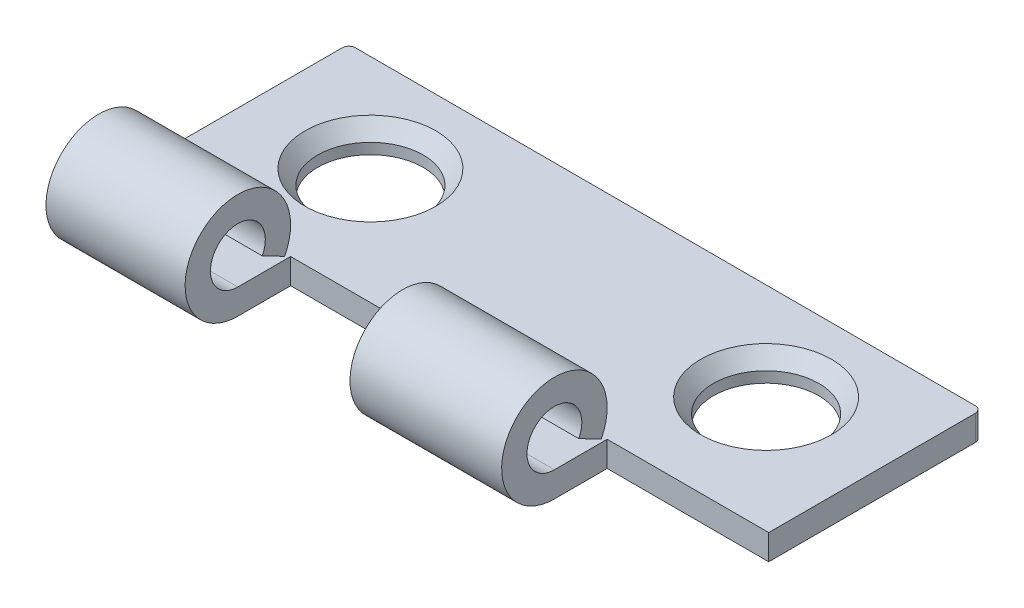
ISO-10303-21;
HEADER;
FILE_DESCRIPTION(('STEP AP214'),'2;1');
FILE_NAME('part.step','',(''),(''),'','','');
FILE_SCHEMA(('AUTOMOTIVE_DESIGN { 1 0 10303 214 1 1 1 1 }'));
ENDSEC;
DATA;
#1=APPLICATION_CONTEXT('core data for automotive mechanical design processes');
#2=APPLICATION_PROTOCOL_DEFINITION('international standard','automotive_design',2000,#1);
#3=PRODUCT_CONTEXT('',#1,'mechanical');
#4=PRODUCT('Part','Part','',(#3));
#5=PRODUCT_RELATED_PRODUCT_CATEGORY('part','',(#4));
#6=PRODUCT_DEFINITION_FORMATION('','',#4);
#7=PRODUCT_DEFINITION_CONTEXT('part definition',#1,'design');
#8=PRODUCT_DEFINITION('design','',#6,#7);
#9=PRODUCT_DEFINITION_SHAPE('','',#8);
#10=(LENGTH_UNIT() NAMED_UNIT(*) SI_UNIT(.MILLI.,.METRE.));
#11=(NAMED_UNIT(*) PLANE_ANGLE_UNIT() SI_UNIT($,.RADIAN.));
#12=(NAMED_UNIT(*) SI_UNIT($,.STERADIAN.) SOLID_ANGLE_UNIT());
#13=UNCERTAINTY_MEASURE_WITH_UNIT(LENGTH_MEASURE(1.E-05),#10,'distance_accuracy_value','');
#14=(GEOMETRIC_REPRESENTATION_CONTEXT(3) GLOBAL_UNCERTAINTY_ASSIGNED_CONTEXT((#13)) GLOBAL_UNIT_ASSIGNED_CONTEXT((#10,
#11,#12)) REPRESENTATION_CONTEXT('',''));
#15=CARTESIAN_POINT('',(0.,0.,0.));
#16=DIRECTION('',(0.,0.,1.));
#17=DIRECTION('',(1.,0.,0.));
#18=AXIS2_PLACEMENT_3D('',#15,#16,#17);
#19=CARTESIAN_POINT('',(-19.05,0.,0.));
#20=DIRECTION('',(1.,0.,0.));
#21=DIRECTION('',(0.,0.,-1.));
#22=AXIS2_PLACEMENT_3D('',#19,#20,#21);
#23=CYLINDRICAL_SURFACE('',#22,3.17500000000008);
#24=DIRECTION('',(1.,0.,0.));
#25=VECTOR('',#24,1.);
#26=CARTESIAN_POINT('',(-19.05,-1.46479493883831,-2.81691334391984));
#27=LINE('',#26,#25);
#28=CARTESIAN_POINT('',(-18.0975,-1.46479493883832,-2.81691334391984));
#29=VERTEX_POINT('',#28);
#30=CARTESIAN_POINT('',(-9.7234375,-1.46479493883832,-2.81691334391984));
#31=VERTEX_POINT('',#30);
#32=EDGE_CURVE('E200',#29,#31,#27,.T.);
#33=ORIENTED_EDGE('',*,*,#32,.F.);
#34=CARTESIAN_POINT('',(-18.0975,0.,0.));
#35=DIRECTION('',(1.,0.,0.));
#36=DIRECTION('',(0.,0.,-1.));
#37=AXIS2_PLACEMENT_3D('',#34,#35,#36);
#38=CIRCLE('',#37,3.17500000000008);
#39=CARTESIAN_POINT('',(-18.0975,-3.175,0.));
#40=VERTEX_POINT('',#39);
#41=EDGE_CURVE('E340',#29,#40,#38,.T.);
#42=ORIENTED_EDGE('',*,*,#41,.T.);
#43=DIRECTION('',(1.,0.,0.));
#44=VECTOR('',#43,1.);
#45=CARTESIAN_POINT('',(-19.05,-3.175,0.));
#46=LINE('',#45,#44);
#47=CARTESIAN_POINT('',(-9.7234375,-3.175,0.));
#48=VERTEX_POINT('',#47);
#49=EDGE_CURVE('E203',#40,#48,#46,.T.);
#50=ORIENTED_EDGE('',*,*,#49,.T.);
#51=CARTESIAN_POINT('',(-9.7234375,0.,0.));
#52=DIRECTION('',(-1.,0.,0.));
#53=DIRECTION('',(0.,0.,1.));
#54=AXIS2_PLACEMENT_3D('',#51,#52,#53);
#55=CIRCLE('',#54,3.17500000000008);
#56=EDGE_CURVE('E266',#48,#31,#55,.T.);
#57=ORIENTED_EDGE('',*,*,#56,.T.);
#58=EDGE_LOOP('',(#33,#42,#50,#57));
#59=FACE_BOUND('',#58,.T.);
#60=ADVANCED_FACE('F41',(#59),#23,.T.);
#61=CARTESIAN_POINT('',(9.32656249999999,0.,0.));
#62=DIRECTION('',(-1.,0.,0.));
#63=DIRECTION('',(0.,0.,1.));
#64=AXIS2_PLACEMENT_3D('',#61,#62,#63);
#65=CIRCLE('',#64,3.17500000000008);
#66=CARTESIAN_POINT('',(9.32656249999999,-3.175,0.));
#67=VERTEX_POINT('',#66);
#68=CARTESIAN_POINT('',(9.32656249999999,-1.46479493883832,-2.81691334391984));
#69=VERTEX_POINT('',#68);
#70=EDGE_CURVE('E311',#67,#69,#65,.T.);
#71=ORIENTED_EDGE('',*,*,#70,.T.);
#72=CARTESIAN_POINT('',(0.198437500000002,-1.46479493883832,-2.81691334391984));
#73=VERTEX_POINT('',#72);
#74=EDGE_CURVE('E199',#73,#69,#27,.T.);
#75=ORIENTED_EDGE('',*,*,#74,.F.);
#76=CARTESIAN_POINT('',(0.198437500000002,0.,0.));
#77=DIRECTION('',(1.,0.,0.));
#78=DIRECTION('',(0.,0.,-1.));
#79=AXIS2_PLACEMENT_3D('',#76,#77,#78);
#80=CIRCLE('',#79,3.17500000000008);
#81=CARTESIAN_POINT('',(0.198437500000001,-3.175,0.));
#82=VERTEX_POINT('',#81);
#83=EDGE_CURVE('E291',#73,#82,#80,.T.);
#84=ORIENTED_EDGE('',*,*,#83,.T.);
#85=EDGE_CURVE('E202',#82,#67,#46,.T.);
#86=ORIENTED_EDGE('',*,*,#85,.T.);
#87=EDGE_LOOP('',(#71,#75,#84,#86));
#88=FACE_BOUND('',#87,.T.);
#89=ADVANCED_FACE('F370',(#88),#23,.T.);
#90=CARTESIAN_POINT('',(-19.05,0.,0.));
#91=DIRECTION('',(1.,0.,0.));
#92=DIRECTION('',(0.,0.,-1.));
#93=AXIS2_PLACEMENT_3D('',#90,#91,#92);
#94=CYLINDRICAL_SURFACE('',#93,1.651);
#95=DIRECTION('',(1.,0.,0.));
#96=VECTOR('',#95,1.);
#97=CARTESIAN_POINT('',(-19.05,-1.651,0.));
#98=LINE('',#97,#96);
#99=CARTESIAN_POINT('',(-18.0975,-1.651,0.));
#100=VERTEX_POINT('',#99);
#101=CARTESIAN_POINT('',(-9.7234375,-1.651,0.));
#102=VERTEX_POINT('',#101);
#103=EDGE_CURVE('E212',#100,#102,#98,.T.);
#104=ORIENTED_EDGE('',*,*,#103,.F.);
#105=CARTESIAN_POINT('',(-18.0975,0.,0.));
#106=DIRECTION('',(1.,0.,0.));
#107=DIRECTION('',(0.,0.,-1.));
#108=AXIS2_PLACEMENT_3D('',#105,#106,#107);
#109=CIRCLE('',#108,1.651);
#110=CARTESIAN_POINT('',(-18.0975,-0.761693368195924,-1.46479493883832));
#111=VERTEX_POINT('',#110);
#112=EDGE_CURVE('E341',#100,#111,#109,.F.);
#113=ORIENTED_EDGE('',*,*,#112,.T.);
#114=DIRECTION('',(1.,0.,0.));
#115=VECTOR('',#114,1.);
#116=CARTESIAN_POINT('',(-19.05,-0.761693368195924,-1.46479493883832));
#117=LINE('',#116,#115);
#118=CARTESIAN_POINT('',(-9.7234375,-0.761693368195924,-1.46479493883832));
#119=VERTEX_POINT('',#118);
#120=EDGE_CURVE('E189',#111,#119,#117,.T.);
#121=ORIENTED_EDGE('',*,*,#120,.T.);
#122=CARTESIAN_POINT('',(-9.7234375,0.,0.));
#123=DIRECTION('',(-1.,0.,0.));
#124=DIRECTION('',(0.,0.,1.));
#125=AXIS2_PLACEMENT_3D('',#122,#123,#124);
#126=CIRCLE('',#125,1.651);
#127=EDGE_CURVE('E319',#119,#102,#126,.F.);
#128=ORIENTED_EDGE('',*,*,#127,.T.);
#129=EDGE_LOOP('',(#104,#113,#121,#128));
#130=FACE_BOUND('',#129,.T.);
#131=ADVANCED_FACE('F388',(#130),#94,.F.);
#132=CARTESIAN_POINT('',(-19.05,-0.761693368195924,-1.46479493883832));
#133=DIRECTION('',(0.,0.887216801234596,-0.461352736641989));
#134=DIRECTION('',(0.,-0.461352736641989,-0.887216801234596));
#135=AXIS2_PLACEMENT_3D('',#132,#133,#134);
#136=PLANE('',#135);
#137=ORIENTED_EDGE('',*,*,#120,.F.);
#138=DIRECTION('',(0.,-0.461352736641989,-0.887216801234595));
#139=VECTOR('',#138,1.);
#140=CARTESIAN_POINT('',(-18.0975,-0.761693368195924,-1.46479493883832));
#141=LINE('',#140,#139);
#142=EDGE_CURVE('E337',#111,#29,#141,.T.);
#143=ORIENTED_EDGE('',*,*,#142,.T.);
#144=ORIENTED_EDGE('',*,*,#32,.T.);
#145=DIRECTION('',(0.,0.461352736641989,0.887216801234596));
#146=VECTOR('',#145,1.);
#147=CARTESIAN_POINT('',(-9.7234375,-0.761693368195924,-1.46479493883832));
#148=LINE('',#147,#146);
#149=EDGE_CURVE('E322',#31,#119,#148,.T.);
#150=ORIENTED_EDGE('',*,*,#149,.T.);
#151=EDGE_LOOP('',(#137,#143,#144,#150));
#152=FACE_BOUND('',#151,.T.);
#153=ADVANCED_FACE('F335',(#152),#136,.F.);
#154=CARTESIAN_POINT('',(0.198437500000002,-0.761693368195924,-1.46479493883832));
#155=VERTEX_POINT('',#154);
#156=CARTESIAN_POINT('',(9.32656249999999,-0.761693368195924,-1.46479493883832));
#157=VERTEX_POINT('',#156);
#158=EDGE_CURVE('E185',#155,#157,#117,.T.);
#159=ORIENTED_EDGE('',*,*,#158,.T.);
#160=CARTESIAN_POINT('',(9.32656249999999,0.,0.));
#161=DIRECTION('',(-1.,0.,0.));
#162=DIRECTION('',(0.,0.,1.));
#163=AXIS2_PLACEMENT_3D('',#160,#161,#162);
#164=CIRCLE('',#163,1.651);
#165=CARTESIAN_POINT('',(9.32656249999999,-1.651,0.));
#166=VERTEX_POINT('',#165);
#167=EDGE_CURVE('E290',#157,#166,#164,.F.);
#168=ORIENTED_EDGE('',*,*,#167,.T.);
#169=CARTESIAN_POINT('',(0.198437500000002,-1.651,0.));
#170=VERTEX_POINT('',#169);
#171=EDGE_CURVE('E211',#170,#166,#98,.T.);
#172=ORIENTED_EDGE('',*,*,#171,.F.);
#173=CARTESIAN_POINT('',(0.198437500000002,0.,0.));
#174=DIRECTION('',(1.,0.,0.));
#175=DIRECTION('',(0.,0.,-1.));
#176=AXIS2_PLACEMENT_3D('',#173,#174,#175);
#177=CIRCLE('',#176,1.651);
#178=EDGE_CURVE('E289',#170,#155,#177,.F.);
#179=ORIENTED_EDGE('',*,*,#178,.T.);
#180=EDGE_LOOP('',(#159,#168,#172,#179));
#181=FACE_BOUND('',#180,.T.);
#182=ADVANCED_FACE('F362',(#181),#94,.F.);
#183=CARTESIAN_POINT('',(-19.05,-1.65099999999999,-16.002));
#184=DIRECTION('',(0.,-1.,0.));
#185=DIRECTION('',(0.,0.,1.));
#186=AXIS2_PLACEMENT_3D('',#183,#184,#185);
#187=PLANE('',#186);
#188=CARTESIAN_POINT('',(11.90625,-1.65099999999999,-10.16));
#189=DIRECTION('',(0.,1.,0.));
#190=DIRECTION('',(0.,0.,-1.));
#191=AXIS2_PLACEMENT_3D('',#188,#189,#190);
#192=CIRCLE('',#191,3.937);
#193=CARTESIAN_POINT('',(11.90625,-1.65099999999999,-14.097));
#194=VERTEX_POINT('',#193);
#195=EDGE_CURVE('E224',#194,#194,#192,.T.);
#196=ORIENTED_EDGE('',*,*,#195,.F.);
#197=EDGE_LOOP('',(#196));
#198=FACE_BOUND('',#197,.T.);
#199=CARTESIAN_POINT('',(-11.90625,-1.65099999999999,-10.16));
#200=DIRECTION('',(0.,1.,0.));
#201=DIRECTION('',(0.,0.,-1.));
#202=AXIS2_PLACEMENT_3D('',#199,#200,#201);
#203=CIRCLE('',#202,3.937);
#204=CARTESIAN_POINT('',(-11.90625,-1.65099999999999,-14.097));
#205=VERTEX_POINT('',#204);
#206=EDGE_CURVE('E343',#205,#205,#203,.T.);
#207=ORIENTED_EDGE('',*,*,#206,.F.);
#208=EDGE_LOOP('',(#207));
#209=FACE_BOUND('',#208,.T.);
#210=DIRECTION('',(1.,0.,0.));
#211=VECTOR('',#210,1.);
#212=CARTESIAN_POINT('',(-19.05,-1.651,-3.17500000000013));
#213=LINE('',#212,#211);
#214=CARTESIAN_POINT('',(-19.05,-1.651,-3.17500000000013));
#215=VERTEX_POINT('',#214);
#216=CARTESIAN_POINT('',(-18.0975,-1.651,-3.17500000000012));
#217=VERTEX_POINT('',#216);
#218=EDGE_CURVE('E56',#215,#217,#213,.T.);
#219=ORIENTED_EDGE('',*,*,#218,.T.);
#220=DIRECTION('',(0.,0.,1.));
#221=VECTOR('',#220,1.);
#222=CARTESIAN_POINT('',(-18.0975,-1.65099999999999,-16.002));
#223=LINE('',#222,#221);
#224=EDGE_CURVE('E345',#217,#100,#223,.T.);
#225=ORIENTED_EDGE('',*,*,#224,.T.);
#226=ORIENTED_EDGE('',*,*,#103,.T.);
#227=DIRECTION('',(0.,0.,-1.));
#228=VECTOR('',#227,1.);
#229=CARTESIAN_POINT('',(-9.7234375,-1.65099999999999,-16.002));
#230=LINE('',#229,#228);
#231=CARTESIAN_POINT('',(-9.7234375,-1.651,-3.17500000000003));
#232=VERTEX_POINT('',#231);
#233=EDGE_CURVE('E277',#102,#232,#230,.T.);
#234=ORIENTED_EDGE('',*,*,#233,.T.);
#235=DIRECTION('',(1.,0.,0.));
#236=VECTOR('',#235,1.);
#237=CARTESIAN_POINT('',(-19.05,-1.651,-3.17500000000003));
#238=LINE('',#237,#236);
#239=CARTESIAN_POINT('',(0.198437500000001,-1.651,-3.17500000000003));
#240=VERTEX_POINT('',#239);
#241=EDGE_CURVE('E197',#232,#240,#238,.T.);
#242=ORIENTED_EDGE('',*,*,#241,.T.);
#243=DIRECTION('',(0.,0.,1.));
#244=VECTOR('',#243,1.);
#245=CARTESIAN_POINT('',(0.198437500000002,-1.65099999999999,-16.002));
#246=LINE('',#245,#244);
#247=EDGE_CURVE('E274',#240,#170,#246,.T.);
#248=ORIENTED_EDGE('',*,*,#247,.T.);
#249=ORIENTED_EDGE('',*,*,#171,.T.);
#250=DIRECTION('',(0.,0.,-1.));
#251=VECTOR('',#250,1.);
#252=CARTESIAN_POINT('',(9.32656249999999,-1.65099999999999,-16.002));
#253=LINE('',#252,#251);
#254=CARTESIAN_POINT('',(9.32656249999999,-1.651,-3.17500000000003));
#255=VERTEX_POINT('',#254);
#256=EDGE_CURVE('E313',#166,#255,#253,.T.);
#257=ORIENTED_EDGE('',*,*,#256,.T.);
#258=DIRECTION('',(1.,0.,0.));
#259=VECTOR('',#258,1.);
#260=CARTESIAN_POINT('',(-19.05,-1.651,-3.17500000000003));
#261=LINE('',#260,#259);
#262=CARTESIAN_POINT('',(19.05,-1.651,-3.17500000000003));
#263=VERTEX_POINT('',#262);
#264=EDGE_CURVE('E261',#255,#263,#261,.T.);
#265=ORIENTED_EDGE('',*,*,#264,.T.);
#266=DIRECTION('',(0.,0.,-1.));
#267=VECTOR('',#266,1.);
#268=CARTESIAN_POINT('',(19.05,-1.65099999999999,-16.002));
#269=LINE('',#268,#267);
#270=CARTESIAN_POINT('',(19.05,-1.65099999999999,-15.605125));
#271=VERTEX_POINT('',#270);
#272=EDGE_CURVE('E195',#263,#271,#269,.T.);
#273=ORIENTED_EDGE('',*,*,#272,.T.);
#274=CARTESIAN_POINT('',(18.653125,-1.65099999999999,-15.605125));
#275=DIRECTION('',(0.,-1.,0.));
#276=DIRECTION('',(0.,0.,1.));
#277=AXIS2_PLACEMENT_3D('',#274,#275,#276);
#278=CIRCLE('',#277,0.396875);
#279=CARTESIAN_POINT('',(18.653125,-1.65099999999999,-16.002));
#280=VERTEX_POINT('',#279);
#281=EDGE_CURVE('E238',#271,#280,#278,.F.);
#282=ORIENTED_EDGE('',*,*,#281,.T.);
#283=DIRECTION('',(1.,0.,0.));
#284=VECTOR('',#283,1.);
#285=CARTESIAN_POINT('',(-19.05,-1.65099999999999,-16.002));
#286=LINE('',#285,#284);
#287=CARTESIAN_POINT('',(-18.653125,-1.65099999999999,-16.002));
#288=VERTEX_POINT('',#287);
#289=EDGE_CURVE('E208',#288,#280,#286,.T.);
#290=ORIENTED_EDGE('',*,*,#289,.F.);
#291=CARTESIAN_POINT('',(-18.653125,-1.65099999999999,-15.605125));
#292=DIRECTION('',(0.,-1.,0.));
#293=DIRECTION('',(0.,0.,1.));
#294=AXIS2_PLACEMENT_3D('',#291,#292,#293);
#295=CIRCLE('',#294,0.396875);
#296=CARTESIAN_POINT('',(-19.05,-1.65099999999999,-15.605125));
#297=VERTEX_POINT('',#296);
#298=EDGE_CURVE('E240',#288,#297,#295,.F.);
#299=ORIENTED_EDGE('',*,*,#298,.T.);
#300=DIRECTION('',(0.,0.,-1.));
#301=VECTOR('',#300,1.);
#302=CARTESIAN_POINT('',(-19.05,-1.65099999999999,-16.002));
#303=LINE('',#302,#301);
#304=EDGE_CURVE('E186',#215,#297,#303,.T.);
#305=ORIENTED_EDGE('',*,*,#304,.F.);
#306=EDGE_LOOP('',(#219,#225,#226,#234,#242,#248,#249,#257,#265,#273,#282,#290,#299,#305));
#307=FACE_BOUND('',#306,.T.);
#308=ADVANCED_FACE('F245',(#198,#209,#307),#187,.F.);
#309=CARTESIAN_POINT('',(-19.05,-3.17499999999999,-16.002));
#310=DIRECTION('',(0.,0.,1.));
#311=DIRECTION('',(1.,0.,0.));
#312=AXIS2_PLACEMENT_3D('',#309,#310,#311);
#313=PLANE('',#312);
#314=DIRECTION('',(1.,0.,0.));
#315=VECTOR('',#314,1.);
#316=CARTESIAN_POINT('',(-19.05,-3.17499999999999,-16.002));
#317=LINE('',#316,#315);
#318=CARTESIAN_POINT('',(-18.653125,-3.17499999999999,-16.002));
#319=VERTEX_POINT('',#318);
#320=CARTESIAN_POINT('',(18.653125,-3.17499999999999,-16.002));
#321=VERTEX_POINT('',#320);
#322=EDGE_CURVE('E205',#319,#321,#317,.T.);
#323=ORIENTED_EDGE('',*,*,#322,.F.);
#324=DIRECTION('',(0.,-1.,0.));
#325=VECTOR('',#324,1.);
#326=CARTESIAN_POINT('',(-18.653125,-3.17499999999999,-16.002));
#327=LINE('',#326,#325);
#328=EDGE_CURVE('E236',#319,#288,#327,.F.);
#329=ORIENTED_EDGE('',*,*,#328,.T.);
#330=ORIENTED_EDGE('',*,*,#289,.T.);
#331=DIRECTION('',(0.,-1.,0.));
#332=VECTOR('',#331,1.);
#333=CARTESIAN_POINT('',(18.653125,-3.17499999999999,-16.002));
#334=LINE('',#333,#332);
#335=EDGE_CURVE('E233',#280,#321,#334,.T.);
#336=ORIENTED_EDGE('',*,*,#335,.T.);
#337=EDGE_LOOP('',(#323,#329,#330,#336));
#338=FACE_BOUND('',#337,.T.);
#339=ADVANCED_FACE('F251',(#338),#313,.F.);
#340=CARTESIAN_POINT('',(-19.05,-3.175,0.));
#341=DIRECTION('',(0.,1.,0.));
#342=DIRECTION('',(0.,0.,-1.));
#343=AXIS2_PLACEMENT_3D('',#340,#341,#342);
#344=PLANE('',#343);
#345=CARTESIAN_POINT('',(-11.90625,-3.175,-10.16));
#346=DIRECTION('',(0.,1.,0.));
#347=DIRECTION('',(0.,0.,-1.));
#348=AXIS2_PLACEMENT_3D('',#345,#346,#347);
#349=CIRCLE('',#348,3.175);
#350=CARTESIAN_POINT('',(-11.90625,-3.17499999999999,-13.335));
#351=VERTEX_POINT('',#350);
#352=EDGE_CURVE('E307',#351,#351,#349,.T.);
#353=ORIENTED_EDGE('',*,*,#352,.T.);
#354=EDGE_LOOP('',(#353));
#355=FACE_BOUND('',#354,.T.);
#356=CARTESIAN_POINT('',(11.90625,-3.175,-10.16));
#357=DIRECTION('',(0.,1.,0.));
#358=DIRECTION('',(0.,0.,-1.));
#359=AXIS2_PLACEMENT_3D('',#356,#357,#358);
#360=CIRCLE('',#359,3.175);
#361=CARTESIAN_POINT('',(11.90625,-3.17499999999999,-13.335));
#362=VERTEX_POINT('',#361);
#363=EDGE_CURVE('E227',#362,#362,#360,.T.);
#364=ORIENTED_EDGE('',*,*,#363,.T.);
#365=EDGE_LOOP('',(#364));
#366=FACE_BOUND('',#365,.T.);
#367=ORIENTED_EDGE('',*,*,#49,.F.);
#368=DIRECTION('',(0.,0.,1.));
#369=VECTOR('',#368,1.);
#370=CARTESIAN_POINT('',(-18.0975,-3.175,-3.17500000000013));
#371=LINE('',#370,#369);
#372=CARTESIAN_POINT('',(-18.0975,-3.175,-3.17500000000013));
#373=VERTEX_POINT('',#372);
#374=EDGE_CURVE('E178',#373,#40,#371,.T.);
#375=ORIENTED_EDGE('',*,*,#374,.F.);
#376=DIRECTION('',(1.,0.,0.));
#377=VECTOR('',#376,1.);
#378=CARTESIAN_POINT('',(-18.0975,-3.175,-3.17500000000013));
#379=LINE('',#378,#377);
#380=CARTESIAN_POINT('',(-19.05,-3.175,-3.17500000000013));
#381=VERTEX_POINT('',#380);
#382=EDGE_CURVE('E167',#381,#373,#379,.T.);
#383=ORIENTED_EDGE('',*,*,#382,.F.);
#384=DIRECTION('',(0.,0.,1.));
#385=VECTOR('',#384,1.);
#386=CARTESIAN_POINT('',(-19.05,-3.175,0.));
#387=LINE('',#386,#385);
#388=CARTESIAN_POINT('',(-19.05,-3.17499999999999,-15.605125));
#389=VERTEX_POINT('',#388);
#390=EDGE_CURVE('E176',#389,#381,#387,.T.);
#391=ORIENTED_EDGE('',*,*,#390,.F.);
#392=CARTESIAN_POINT('',(-18.653125,-3.17499999999999,-15.605125));
#393=DIRECTION('',(0.,1.,0.));
#394=DIRECTION('',(0.,0.,-1.));
#395=AXIS2_PLACEMENT_3D('',#392,#393,#394);
#396=CIRCLE('',#395,0.396875);
#397=EDGE_CURVE('E231',#389,#319,#396,.F.);
#398=ORIENTED_EDGE('',*,*,#397,.T.);
#399=ORIENTED_EDGE('',*,*,#322,.T.);
#400=CARTESIAN_POINT('',(18.653125,-3.17499999999999,-15.605125));
#401=DIRECTION('',(0.,1.,0.));
#402=DIRECTION('',(0.,0.,-1.));
#403=AXIS2_PLACEMENT_3D('',#400,#401,#402);
#404=CIRCLE('',#403,0.396875);
#405=CARTESIAN_POINT('',(19.05,-3.17499999999999,-15.605125));
#406=VERTEX_POINT('',#405);
#407=EDGE_CURVE('E229',#321,#406,#404,.F.);
#408=ORIENTED_EDGE('',*,*,#407,.T.);
#409=DIRECTION('',(0.,0.,1.));
#410=VECTOR('',#409,1.);
#411=CARTESIAN_POINT('',(19.05,-3.175,0.));
#412=LINE('',#411,#410);
#413=CARTESIAN_POINT('',(19.05,-3.175,-3.17500000000003));
#414=VERTEX_POINT('',#413);
#415=EDGE_CURVE('E191',#406,#414,#412,.T.);
#416=ORIENTED_EDGE('',*,*,#415,.T.);
#417=DIRECTION('',(-1.,0.,0.));
#418=VECTOR('',#417,1.);
#419=CARTESIAN_POINT('',(9.525,-3.175,-3.17500000000003));
#420=LINE('',#419,#418);
#421=CARTESIAN_POINT('',(9.32656249999999,-3.175,-3.17500000000003));
#422=VERTEX_POINT('',#421);
#423=EDGE_CURVE('E262',#414,#422,#420,.T.);
#424=ORIENTED_EDGE('',*,*,#423,.T.);
#425=DIRECTION('',(0.,0.,1.));
#426=VECTOR('',#425,1.);
#427=CARTESIAN_POINT('',(9.32656249999999,-3.175,3.17500000000013));
#428=LINE('',#427,#426);
#429=EDGE_CURVE('E294',#422,#67,#428,.T.);
#430=ORIENTED_EDGE('',*,*,#429,.T.);
#431=ORIENTED_EDGE('',*,*,#85,.F.);
#432=DIRECTION('',(0.,0.,-1.));
#433=VECTOR('',#432,1.);
#434=CARTESIAN_POINT('',(0.198437500000001,-3.175,3.17500000000013));
#435=LINE('',#434,#433);
#436=CARTESIAN_POINT('',(0.198437500000001,-3.175,-3.17500000000003));
#437=VERTEX_POINT('',#436);
#438=EDGE_CURVE('E295',#82,#437,#435,.T.);
#439=ORIENTED_EDGE('',*,*,#438,.T.);
#440=DIRECTION('',(-1.,0.,0.));
#441=VECTOR('',#440,1.);
#442=CARTESIAN_POINT('',(-9.525,-3.175,-3.17500000000003));
#443=LINE('',#442,#441);
#444=CARTESIAN_POINT('',(-9.7234375,-3.175,-3.17500000000003));
#445=VERTEX_POINT('',#444);
#446=EDGE_CURVE('E264',#437,#445,#443,.T.);
#447=ORIENTED_EDGE('',*,*,#446,.T.);
#448=DIRECTION('',(0.,0.,1.));
#449=VECTOR('',#448,1.);
#450=CARTESIAN_POINT('',(-9.7234375,-3.175,3.17500000000013));
#451=LINE('',#450,#449);
#452=EDGE_CURVE('E304',#445,#48,#451,.T.);
#453=ORIENTED_EDGE('',*,*,#452,.T.);
#454=EDGE_LOOP('',(#367,#375,#383,#391,#398,#399,#408,#416,#424,#430,#431,#439,#447,#453));
#455=FACE_BOUND('',#454,.T.);
#456=ADVANCED_FACE('F175',(#355,#366,#455),#344,.F.);
#457=ORIENTED_EDGE('',*,*,#74,.T.);
#458=DIRECTION('',(0.,0.461352736641989,0.887216801234596));
#459=VECTOR('',#458,1.);
#460=CARTESIAN_POINT('',(9.32656249999999,-0.761693368195924,-1.46479493883832));
#461=LINE('',#460,#459);
#462=EDGE_CURVE('E217',#69,#157,#461,.T.);
#463=ORIENTED_EDGE('',*,*,#462,.T.);
#464=ORIENTED_EDGE('',*,*,#158,.F.);
#465=DIRECTION('',(0.,-0.461352736641989,-0.887216801234596));
#466=VECTOR('',#465,1.);
#467=CARTESIAN_POINT('',(0.198437500000002,-0.761693368195924,-1.46479493883832));
#468=LINE('',#467,#466);
#469=EDGE_CURVE('E214',#155,#73,#468,.T.);
#470=ORIENTED_EDGE('',*,*,#469,.T.);
#471=EDGE_LOOP('',(#457,#463,#464,#470));
#472=FACE_BOUND('',#471,.T.);
#473=ADVANCED_FACE('F367',(#472),#136,.F.);
#474=CARTESIAN_POINT('',(-19.05,0.,0.));
#475=DIRECTION('',(1.,0.,0.));
#476=DIRECTION('',(0.,0.,-1.));
#477=AXIS2_PLACEMENT_3D('',#474,#475,#476);
#478=PLANE('',#477);
#479=ORIENTED_EDGE('',*,*,#390,.T.);
#480=DIRECTION('',(0.,1.,0.));
#481=VECTOR('',#480,1.);
#482=CARTESIAN_POINT('',(-19.05,0.,-3.17500000000013));
#483=LINE('',#482,#481);
#484=EDGE_CURVE('E11',#381,#215,#483,.T.);
#485=ORIENTED_EDGE('',*,*,#484,.T.);
#486=ORIENTED_EDGE('',*,*,#304,.T.);
#487=DIRECTION('',(0.,-1.,0.));
#488=VECTOR('',#487,1.);
#489=CARTESIAN_POINT('',(-19.05,0.,-15.605125));
#490=LINE('',#489,#488);
#491=EDGE_CURVE('E184',#297,#389,#490,.T.);
#492=ORIENTED_EDGE('',*,*,#491,.T.);
#493=EDGE_LOOP('',(#479,#485,#486,#492));
#494=FACE_BOUND('',#493,.T.);
#495=ADVANCED_FACE('F182',(#494),#478,.F.);
#496=CARTESIAN_POINT('',(19.05,0.,0.));
#497=DIRECTION('',(1.,0.,0.));
#498=DIRECTION('',(0.,0.,-1.));
#499=AXIS2_PLACEMENT_3D('',#496,#497,#498);
#500=PLANE('',#499);
#501=ORIENTED_EDGE('',*,*,#415,.F.);
#502=DIRECTION('',(0.,-1.,0.));
#503=VECTOR('',#502,1.);
#504=CARTESIAN_POINT('',(19.05,-1.65099999999999,-15.605125));
#505=LINE('',#504,#503);
#506=EDGE_CURVE('E49',#406,#271,#505,.F.);
#507=ORIENTED_EDGE('',*,*,#506,.T.);
#508=ORIENTED_EDGE('',*,*,#272,.F.);
#509=DIRECTION('',(0.,1.,0.));
#510=VECTOR('',#509,1.);
#511=CARTESIAN_POINT('',(19.05,-3.175,-3.17500000000003));
#512=LINE('',#511,#510);
#513=EDGE_CURVE('E258',#414,#263,#512,.T.);
#514=ORIENTED_EDGE('',*,*,#513,.F.);
#515=EDGE_LOOP('',(#501,#507,#508,#514));
#516=FACE_BOUND('',#515,.T.);
#517=ADVANCED_FACE('F257',(#516),#500,.T.);
#518=CARTESIAN_POINT('',(-9.525,-3.175,-3.17500000000003));
#519=DIRECTION('',(0.,0.,-1.));
#520=DIRECTION('',(-1.,0.,0.));
#521=AXIS2_PLACEMENT_3D('',#518,#519,#520);
#522=PLANE('',#521);
#523=ORIENTED_EDGE('',*,*,#241,.F.);
#524=DIRECTION('',(0.,1.,0.));
#525=VECTOR('',#524,1.);
#526=CARTESIAN_POINT('',(-9.7234375,-3.175,-3.17500000000003));
#527=LINE('',#526,#525);
#528=EDGE_CURVE('E300',#445,#232,#527,.T.);
#529=ORIENTED_EDGE('',*,*,#528,.F.);
#530=ORIENTED_EDGE('',*,*,#446,.F.);
#531=DIRECTION('',(0.,1.,0.));
#532=VECTOR('',#531,1.);
#533=CARTESIAN_POINT('',(0.198437500000001,-3.175,-3.17500000000003));
#534=LINE('',#533,#532);
#535=EDGE_CURVE('E286',#437,#240,#534,.T.);
#536=ORIENTED_EDGE('',*,*,#535,.T.);
#537=EDGE_LOOP('',(#523,#529,#530,#536));
#538=FACE_BOUND('',#537,.T.);
#539=ADVANCED_FACE('F293',(#538),#522,.F.);
#540=CARTESIAN_POINT('',(9.525,-3.175,-3.17500000000003));
#541=DIRECTION('',(0.,0.,-1.));
#542=DIRECTION('',(-1.,0.,0.));
#543=AXIS2_PLACEMENT_3D('',#540,#541,#542);
#544=PLANE('',#543);
#545=ORIENTED_EDGE('',*,*,#264,.F.);
#546=DIRECTION('',(0.,1.,0.));
#547=VECTOR('',#546,1.);
#548=CARTESIAN_POINT('',(9.32656249999999,-3.175,-3.17500000000003));
#549=LINE('',#548,#547);
#550=EDGE_CURVE('E298',#422,#255,#549,.T.);
#551=ORIENTED_EDGE('',*,*,#550,.F.);
#552=ORIENTED_EDGE('',*,*,#423,.F.);
#553=ORIENTED_EDGE('',*,*,#513,.T.);
#554=EDGE_LOOP('',(#545,#551,#552,#553));
#555=FACE_BOUND('',#554,.T.);
#556=ADVANCED_FACE('F373',(#555),#544,.F.);
#557=CARTESIAN_POINT('',(9.32656249999999,-3.175,3.17500000000013));
#558=DIRECTION('',(-1.,0.,0.));
#559=DIRECTION('',(0.,0.,1.));
#560=AXIS2_PLACEMENT_3D('',#557,#558,#559);
#561=PLANE('',#560);
#562=ORIENTED_EDGE('',*,*,#167,.F.);
#563=ORIENTED_EDGE('',*,*,#462,.F.);
#564=ORIENTED_EDGE('',*,*,#70,.F.);
#565=ORIENTED_EDGE('',*,*,#429,.F.);
#566=ORIENTED_EDGE('',*,*,#550,.T.);
#567=ORIENTED_EDGE('',*,*,#256,.F.);
#568=EDGE_LOOP('',(#562,#563,#564,#565,#566,#567));
#569=FACE_BOUND('',#568,.T.);
#570=ADVANCED_FACE('F360',(#569),#561,.F.);
#571=CARTESIAN_POINT('',(0.198437500000001,-3.175,3.17500000000013));
#572=DIRECTION('',(1.,0.,0.));
#573=DIRECTION('',(0.,0.,-1.));
#574=AXIS2_PLACEMENT_3D('',#571,#572,#573);
#575=PLANE('',#574);
#576=ORIENTED_EDGE('',*,*,#83,.F.);
#577=ORIENTED_EDGE('',*,*,#469,.F.);
#578=ORIENTED_EDGE('',*,*,#178,.F.);
#579=ORIENTED_EDGE('',*,*,#247,.F.);
#580=ORIENTED_EDGE('',*,*,#535,.F.);
#581=ORIENTED_EDGE('',*,*,#438,.F.);
#582=EDGE_LOOP('',(#576,#577,#578,#579,#580,#581));
#583=FACE_BOUND('',#582,.T.);
#584=ADVANCED_FACE('F284',(#583),#575,.F.);
#585=CARTESIAN_POINT('',(-9.7234375,-3.175,3.17500000000013));
#586=DIRECTION('',(-1.,0.,0.));
#587=DIRECTION('',(0.,0.,1.));
#588=AXIS2_PLACEMENT_3D('',#585,#586,#587);
#589=PLANE('',#588);
#590=ORIENTED_EDGE('',*,*,#452,.F.);
#591=ORIENTED_EDGE('',*,*,#528,.T.);
#592=ORIENTED_EDGE('',*,*,#233,.F.);
#593=ORIENTED_EDGE('',*,*,#127,.F.);
#594=ORIENTED_EDGE('',*,*,#149,.F.);
#595=ORIENTED_EDGE('',*,*,#56,.F.);
#596=EDGE_LOOP('',(#590,#591,#592,#593,#594,#595));
#597=FACE_BOUND('',#596,.T.);
#598=ADVANCED_FACE('F332',(#597),#589,.F.);
#599=CARTESIAN_POINT('',(11.90625,-3.175,-10.16));
#600=DIRECTION('',(0.,1.,0.));
#601=DIRECTION('',(0.,0.,-1.));
#602=AXIS2_PLACEMENT_3D('',#599,#600,#601);
#603=CYLINDRICAL_SURFACE('',#602,3.175);
#604=CARTESIAN_POINT('',(11.90625,-2.5275807263024,-10.16));
#605=DIRECTION('',(0.,1.,0.));
#606=DIRECTION('',(0.,0.,-1.));
#607=AXIS2_PLACEMENT_3D('',#604,#605,#606);
#608=CIRCLE('',#607,3.175);
#609=CARTESIAN_POINT('',(11.90625,-2.5275807263024,-13.335));
#610=VERTEX_POINT('',#609);
#611=EDGE_CURVE('E223',#610,#610,#608,.T.);
#612=ORIENTED_EDGE('',*,*,#611,.T.);
#613=EDGE_LOOP('',(#612));
#614=FACE_BOUND('',#613,.T.);
#615=ORIENTED_EDGE('',*,*,#363,.F.);
#616=EDGE_LOOP('',(#615));
#617=FACE_BOUND('',#616,.T.);
#618=ADVANCED_FACE('F423',(#614,#617),#603,.F.);
#619=CARTESIAN_POINT('',(-11.90625,-3.175,-10.16));
#620=DIRECTION('',(0.,1.,0.));
#621=DIRECTION('',(0.,0.,-1.));
#622=AXIS2_PLACEMENT_3D('',#619,#620,#621);
#623=CYLINDRICAL_SURFACE('',#622,3.175);
#624=CARTESIAN_POINT('',(-11.90625,-2.5275807263024,-10.16));
#625=DIRECTION('',(0.,1.,0.));
#626=DIRECTION('',(0.,0.,-1.));
#627=AXIS2_PLACEMENT_3D('',#624,#625,#626);
#628=CIRCLE('',#627,3.175);
#629=CARTESIAN_POINT('',(-11.90625,-2.5275807263024,-13.335));
#630=VERTEX_POINT('',#629);
#631=EDGE_CURVE('E220',#630,#630,#628,.T.);
#632=ORIENTED_EDGE('',*,*,#631,.T.);
#633=EDGE_LOOP('',(#632));
#634=FACE_BOUND('',#633,.T.);
#635=ORIENTED_EDGE('',*,*,#352,.F.);
#636=EDGE_LOOP('',(#635));
#637=FACE_BOUND('',#636,.T.);
#638=ADVANCED_FACE('F414',(#634,#637),#623,.F.);
#639=CARTESIAN_POINT('',(-11.90625,-1.65099999999999,-10.16));
#640=DIRECTION('',(0.,1.,0.));
#641=DIRECTION('',(0.,0.,-1.));
#642=AXIS2_PLACEMENT_3D('',#639,#640,#641);
#643=CONICAL_SURFACE('',#642,3.937,0.715584993317677);
#644=ORIENTED_EDGE('',*,*,#206,.T.);
#645=EDGE_LOOP('',(#644));
#646=FACE_BOUND('',#645,.T.);
#647=ORIENTED_EDGE('',*,*,#631,.F.);
#648=EDGE_LOOP('',(#647));
#649=FACE_BOUND('',#648,.T.);
#650=ADVANCED_FACE('F408',(#646,#649),#643,.F.);
#651=CARTESIAN_POINT('',(11.90625,-1.65099999999999,-10.16));
#652=DIRECTION('',(0.,1.,0.));
#653=DIRECTION('',(0.,0.,-1.));
#654=AXIS2_PLACEMENT_3D('',#651,#652,#653);
#655=CONICAL_SURFACE('',#654,3.937,0.715584993317677);
#656=ORIENTED_EDGE('',*,*,#195,.T.);
#657=EDGE_LOOP('',(#656));
#658=FACE_BOUND('',#657,.T.);
#659=ORIENTED_EDGE('',*,*,#611,.F.);
#660=EDGE_LOOP('',(#659));
#661=FACE_BOUND('',#660,.T.);
#662=ADVANCED_FACE('F402',(#658,#661),#655,.F.);
#663=CARTESIAN_POINT('',(-18.653125,0.,-15.605125));
#664=DIRECTION('',(0.,-1.,0.));
#665=DIRECTION('',(0.,0.,1.));
#666=AXIS2_PLACEMENT_3D('',#663,#664,#665);
#667=CYLINDRICAL_SURFACE('',#666,0.396875);
#668=ORIENTED_EDGE('',*,*,#298,.F.);
#669=ORIENTED_EDGE('',*,*,#328,.F.);
#670=ORIENTED_EDGE('',*,*,#397,.F.);
#671=ORIENTED_EDGE('',*,*,#491,.F.);
#672=EDGE_LOOP('',(#668,#669,#670,#671));
#673=FACE_BOUND('',#672,.T.);
#674=ADVANCED_FACE('F248',(#673),#667,.T.);
#675=CARTESIAN_POINT('',(18.653125,-3.17499999999999,-15.605125));
#676=DIRECTION('',(0.,1.,0.));
#677=DIRECTION('',(0.,0.,-1.));
#678=AXIS2_PLACEMENT_3D('',#675,#676,#677);
#679=CYLINDRICAL_SURFACE('',#678,0.396875);
#680=ORIENTED_EDGE('',*,*,#281,.F.);
#681=ORIENTED_EDGE('',*,*,#506,.F.);
#682=ORIENTED_EDGE('',*,*,#407,.F.);
#683=ORIENTED_EDGE('',*,*,#335,.F.);
#684=EDGE_LOOP('',(#680,#681,#682,#683));
#685=FACE_BOUND('',#684,.T.);
#686=ADVANCED_FACE('F43',(#685),#679,.T.);
#687=CARTESIAN_POINT('',(-18.0975,3.17500000000017,-3.17500000000012));
#688=DIRECTION('',(1.,0.,0.));
#689=DIRECTION('',(0.,0.,-1.));
#690=AXIS2_PLACEMENT_3D('',#687,#688,#689);
#691=PLANE('',#690);
#692=ORIENTED_EDGE('',*,*,#41,.F.);
#693=ORIENTED_EDGE('',*,*,#142,.F.);
#694=ORIENTED_EDGE('',*,*,#112,.F.);
#695=ORIENTED_EDGE('',*,*,#224,.F.);
#696=DIRECTION('',(0.,-1.,0.));
#697=VECTOR('',#696,1.);
#698=CARTESIAN_POINT('',(-18.0975,3.17500000000017,-3.17500000000012));
#699=LINE('',#698,#697);
#700=EDGE_CURVE('E179',#217,#373,#699,.T.);
#701=ORIENTED_EDGE('',*,*,#700,.T.);
#702=ORIENTED_EDGE('',*,*,#374,.T.);
#703=EDGE_LOOP('',(#692,#693,#694,#695,#701,#702));
#704=FACE_BOUND('',#703,.T.);
#705=ADVANCED_FACE('F407',(#704),#691,.F.);
#706=CARTESIAN_POINT('',(-18.0975,3.17500000000017,-3.17500000000012));
#707=DIRECTION('',(0.,0.,-1.));
#708=DIRECTION('',(-1.,0.,0.));
#709=AXIS2_PLACEMENT_3D('',#706,#707,#708);
#710=PLANE('',#709);
#711=ORIENTED_EDGE('',*,*,#484,.F.);
#712=ORIENTED_EDGE('',*,*,#382,.T.);
#713=ORIENTED_EDGE('',*,*,#700,.F.);
#714=ORIENTED_EDGE('',*,*,#218,.F.);
#715=EDGE_LOOP('',(#711,#712,#713,#714));
#716=FACE_BOUND('',#715,.T.);
#717=ADVANCED_FACE('F166',(#716),#710,.F.);
#718=CLOSED_SHELL('',(#60,#89,#131,#153,#182,#308,#339,#456,#473,#495,#517,#539,#556,#570,#584,
#598,#618,#638,#650,#662,#674,#686,#705,#717));
#719=MANIFOLD_SOLID_BREP('B2',#718);
#720=ADVANCED_BREP_SHAPE_REPRESENTATION('',(#18,#719),#14);
#721=SHAPE_DEFINITION_REPRESENTATION(#9,#720);
ENDSEC;
END-ISO-10303-21;
